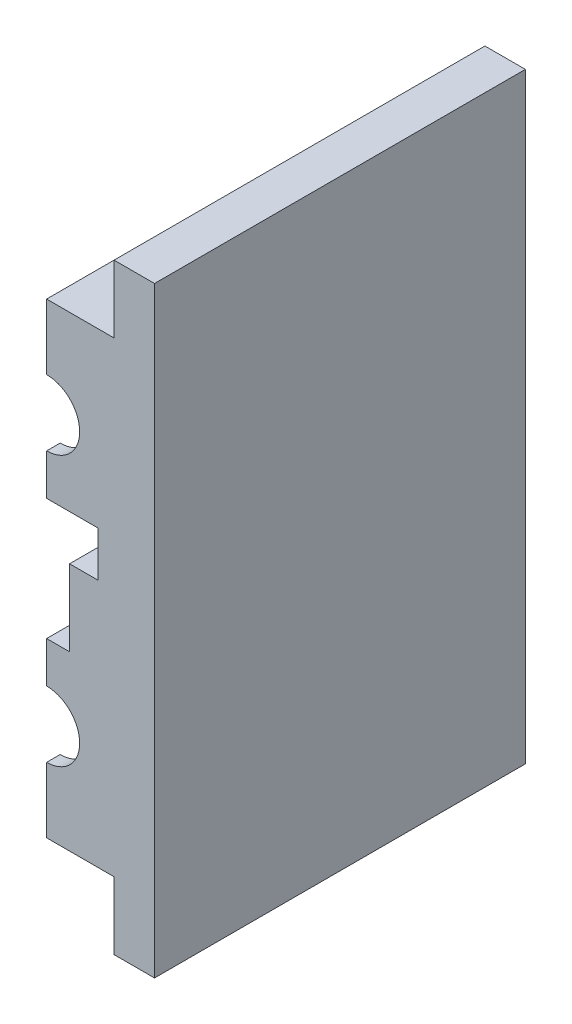
ISO-10303-21;
HEADER;
FILE_DESCRIPTION(('STEP AP214'),'2;1');
FILE_NAME('part.step','',(''),(''),'','','');
FILE_SCHEMA(('AUTOMOTIVE_DESIGN { 1 0 10303 214 1 1 1 1 }'));
ENDSEC;
DATA;
#1=APPLICATION_CONTEXT('core data for automotive mechanical design processes');
#2=APPLICATION_PROTOCOL_DEFINITION('international standard','automotive_design',2000,#1);
#3=PRODUCT_CONTEXT('',#1,'mechanical');
#4=PRODUCT('Part','Part','',(#3));
#5=PRODUCT_RELATED_PRODUCT_CATEGORY('part','',(#4));
#6=PRODUCT_DEFINITION_FORMATION('','',#4);
#7=PRODUCT_DEFINITION_CONTEXT('part definition',#1,'design');
#8=PRODUCT_DEFINITION('design','',#6,#7);
#9=PRODUCT_DEFINITION_SHAPE('','',#8);
#10=(LENGTH_UNIT() NAMED_UNIT(*) SI_UNIT(.MILLI.,.METRE.));
#11=(NAMED_UNIT(*) PLANE_ANGLE_UNIT() SI_UNIT($,.RADIAN.));
#12=(NAMED_UNIT(*) SI_UNIT($,.STERADIAN.) SOLID_ANGLE_UNIT());
#13=UNCERTAINTY_MEASURE_WITH_UNIT(LENGTH_MEASURE(1.E-05),#10,'distance_accuracy_value','');
#14=(GEOMETRIC_REPRESENTATION_CONTEXT(3) GLOBAL_UNCERTAINTY_ASSIGNED_CONTEXT((#13)) GLOBAL_UNIT_ASSIGNED_CONTEXT((#10,
#11,#12)) REPRESENTATION_CONTEXT('',''));
#15=CARTESIAN_POINT('',(0.,0.,0.));
#16=DIRECTION('',(0.,0.,1.));
#17=DIRECTION('',(1.,0.,0.));
#18=AXIS2_PLACEMENT_3D('',#15,#16,#17);
#19=CARTESIAN_POINT('',(-16.,-64.6,55.));
#20=DIRECTION('',(0.,0.,-1.));
#21=DIRECTION('',(-1.,0.,0.));
#22=AXIS2_PLACEMENT_3D('',#19,#20,#21);
#23=CYLINDRICAL_SURFACE('',#22,7.6);
#24=CARTESIAN_POINT('',(-16.,-64.6,53.));
#25=DIRECTION('',(0.,0.,-1.));
#26=DIRECTION('',(1.,0.,0.));
#27=AXIS2_PLACEMENT_3D('',#24,#25,#26);
#28=CIRCLE('',#27,7.6);
#29=CARTESIAN_POINT('',(-16.,-57.,53.));
#30=VERTEX_POINT('',#29);
#31=CARTESIAN_POINT('',(-16.,-72.2,53.));
#32=VERTEX_POINT('',#31);
#33=EDGE_CURVE('E423',#30,#32,#28,.T.);
#34=ORIENTED_EDGE('',*,*,#33,.F.);
#35=DIRECTION('',(0.,0.,-1.));
#36=VECTOR('',#35,1.);
#37=CARTESIAN_POINT('',(-16.,-57.,55.));
#38=LINE('',#37,#36);
#39=CARTESIAN_POINT('',(-16.,-57.,28.5));
#40=VERTEX_POINT('',#39);
#41=EDGE_CURVE('E344',#30,#40,#38,.T.);
#42=ORIENTED_EDGE('',*,*,#41,.T.);
#43=CARTESIAN_POINT('',(-16.,-64.6,28.5));
#44=DIRECTION('',(0.,0.,-1.));
#45=DIRECTION('',(-1.,0.,0.));
#46=AXIS2_PLACEMENT_3D('',#43,#44,#45);
#47=CIRCLE('',#46,7.6);
#48=CARTESIAN_POINT('',(-16.,-72.2,28.5));
#49=VERTEX_POINT('',#48);
#50=EDGE_CURVE('E485',#40,#49,#47,.T.);
#51=ORIENTED_EDGE('',*,*,#50,.T.);
#52=DIRECTION('',(0.,0.,-1.));
#53=VECTOR('',#52,1.);
#54=CARTESIAN_POINT('',(-16.,-72.2,55.));
#55=LINE('',#54,#53);
#56=EDGE_CURVE('E342',#32,#49,#55,.T.);
#57=ORIENTED_EDGE('',*,*,#56,.F.);
#58=EDGE_LOOP('',(#34,#42,#51,#57));
#59=FACE_BOUND('',#58,.T.);
#60=ADVANCED_FACE('F35',(#59),#23,.F.);
#61=CARTESIAN_POINT('',(-16.,-24.6,55.));
#62=DIRECTION('',(0.,0.,-1.));
#63=DIRECTION('',(-1.,0.,0.));
#64=AXIS2_PLACEMENT_3D('',#61,#62,#63);
#65=CYLINDRICAL_SURFACE('',#64,7.6);
#66=CARTESIAN_POINT('',(-16.,-24.6,53.));
#67=DIRECTION('',(0.,0.,-1.));
#68=DIRECTION('',(1.,0.,0.));
#69=AXIS2_PLACEMENT_3D('',#66,#67,#68);
#70=CIRCLE('',#69,7.6);
#71=CARTESIAN_POINT('',(-16.,-17.,53.));
#72=VERTEX_POINT('',#71);
#73=CARTESIAN_POINT('',(-16.,-32.2,53.));
#74=VERTEX_POINT('',#73);
#75=EDGE_CURVE('E438',#72,#74,#70,.T.);
#76=ORIENTED_EDGE('',*,*,#75,.F.);
#77=DIRECTION('',(0.,0.,-1.));
#78=VECTOR('',#77,1.);
#79=CARTESIAN_POINT('',(-16.,-17.,55.));
#80=LINE('',#79,#78);
#81=CARTESIAN_POINT('',(-16.,-17.,28.5));
#82=VERTEX_POINT('',#81);
#83=EDGE_CURVE('E359',#72,#82,#80,.T.);
#84=ORIENTED_EDGE('',*,*,#83,.T.);
#85=CARTESIAN_POINT('',(-16.,-24.6,28.5));
#86=DIRECTION('',(0.,0.,-1.));
#87=DIRECTION('',(-1.,0.,0.));
#88=AXIS2_PLACEMENT_3D('',#85,#86,#87);
#89=CIRCLE('',#88,7.6);
#90=CARTESIAN_POINT('',(-16.,-32.2,28.5));
#91=VERTEX_POINT('',#90);
#92=EDGE_CURVE('E509',#82,#91,#89,.T.);
#93=ORIENTED_EDGE('',*,*,#92,.T.);
#94=DIRECTION('',(0.,0.,-1.));
#95=VECTOR('',#94,1.);
#96=CARTESIAN_POINT('',(-16.,-32.2,55.));
#97=LINE('',#96,#95);
#98=EDGE_CURVE('E356',#74,#91,#97,.T.);
#99=ORIENTED_EDGE('',*,*,#98,.F.);
#100=EDGE_LOOP('',(#76,#84,#93,#99));
#101=FACE_BOUND('',#100,.T.);
#102=ADVANCED_FACE('F613',(#101),#65,.F.);
#103=CARTESIAN_POINT('',(-6.,0.,55.));
#104=DIRECTION('',(0.,-1.,0.));
#105=DIRECTION('',(0.,0.,-1.));
#106=AXIS2_PLACEMENT_3D('',#103,#104,#105);
#107=PLANE('',#106);
#108=DIRECTION('',(-1.,0.,0.));
#109=VECTOR('',#108,1.);
#110=CARTESIAN_POINT('',(-6.,0.,0.));
#111=LINE('',#110,#109);
#112=CARTESIAN_POINT('',(0.,0.,0.));
#113=VERTEX_POINT('',#112);
#114=CARTESIAN_POINT('',(-6.,0.,0.));
#115=VERTEX_POINT('',#114);
#116=EDGE_CURVE('E295',#113,#115,#111,.T.);
#117=ORIENTED_EDGE('',*,*,#116,.T.);
#118=DIRECTION('',(0.,0.,-1.));
#119=VECTOR('',#118,1.);
#120=CARTESIAN_POINT('',(-6.,0.,55.));
#121=LINE('',#120,#119);
#122=CARTESIAN_POINT('',(-6.,0.,55.));
#123=VERTEX_POINT('',#122);
#124=EDGE_CURVE('E11',#123,#115,#121,.T.);
#125=ORIENTED_EDGE('',*,*,#124,.F.);
#126=DIRECTION('',(-1.,0.,0.));
#127=VECTOR('',#126,1.);
#128=CARTESIAN_POINT('',(-6.,0.,55.));
#129=LINE('',#128,#127);
#130=CARTESIAN_POINT('',(0.,0.,55.));
#131=VERTEX_POINT('',#130);
#132=EDGE_CURVE('E326',#131,#123,#129,.T.);
#133=ORIENTED_EDGE('',*,*,#132,.F.);
#134=DIRECTION('',(0.,0.,-1.));
#135=VECTOR('',#134,1.);
#136=CARTESIAN_POINT('',(0.,0.,55.));
#137=LINE('',#136,#135);
#138=EDGE_CURVE('E294',#131,#113,#137,.T.);
#139=ORIENTED_EDGE('',*,*,#138,.T.);
#140=EDGE_LOOP('',(#117,#125,#133,#139));
#141=FACE_BOUND('',#140,.T.);
#142=ADVANCED_FACE('F37',(#141),#107,.F.);
#143=CARTESIAN_POINT('',(-6.,-10.,55.));
#144=DIRECTION('',(1.,0.,0.));
#145=DIRECTION('',(0.,1.,0.));
#146=AXIS2_PLACEMENT_3D('',#143,#144,#145);
#147=PLANE('',#146);
#148=DIRECTION('',(0.,-1.,0.));
#149=VECTOR('',#148,1.);
#150=CARTESIAN_POINT('',(-6.,-10.,0.));
#151=LINE('',#150,#149);
#152=CARTESIAN_POINT('',(-6.,-10.,0.));
#153=VERTEX_POINT('',#152);
#154=EDGE_CURVE('E298',#115,#153,#151,.T.);
#155=ORIENTED_EDGE('',*,*,#154,.T.);
#156=DIRECTION('',(0.,0.,-1.));
#157=VECTOR('',#156,1.);
#158=CARTESIAN_POINT('',(-6.,-10.,55.));
#159=LINE('',#158,#157);
#160=CARTESIAN_POINT('',(-6.,-10.,55.));
#161=VERTEX_POINT('',#160);
#162=EDGE_CURVE('E43',#161,#153,#159,.T.);
#163=ORIENTED_EDGE('',*,*,#162,.F.);
#164=DIRECTION('',(0.,-1.,0.));
#165=VECTOR('',#164,1.);
#166=CARTESIAN_POINT('',(-6.,-10.,55.));
#167=LINE('',#166,#165);
#168=EDGE_CURVE('E397',#123,#161,#167,.T.);
#169=ORIENTED_EDGE('',*,*,#168,.F.);
#170=ORIENTED_EDGE('',*,*,#124,.T.);
#171=EDGE_LOOP('',(#155,#163,#169,#170));
#172=FACE_BOUND('',#171,.T.);
#173=ADVANCED_FACE('F535',(#172),#147,.F.);
#174=CARTESIAN_POINT('',(-16.,-10.,55.));
#175=DIRECTION('',(0.,-1.,0.));
#176=DIRECTION('',(0.,0.,-1.));
#177=AXIS2_PLACEMENT_3D('',#174,#175,#176);
#178=PLANE('',#177);
#179=DIRECTION('',(-1.,0.,0.));
#180=VECTOR('',#179,1.);
#181=CARTESIAN_POINT('',(-16.,-10.,0.));
#182=LINE('',#181,#180);
#183=CARTESIAN_POINT('',(-16.,-10.,0.));
#184=VERTEX_POINT('',#183);
#185=EDGE_CURVE('E301',#153,#184,#182,.T.);
#186=ORIENTED_EDGE('',*,*,#185,.T.);
#187=DIRECTION('',(0.,0.,-1.));
#188=VECTOR('',#187,1.);
#189=CARTESIAN_POINT('',(-16.,-10.,55.));
#190=LINE('',#189,#188);
#191=CARTESIAN_POINT('',(-16.,-10.,55.));
#192=VERTEX_POINT('',#191);
#193=EDGE_CURVE('E361',#192,#184,#190,.T.);
#194=ORIENTED_EDGE('',*,*,#193,.F.);
#195=DIRECTION('',(-1.,0.,0.));
#196=VECTOR('',#195,1.);
#197=CARTESIAN_POINT('',(-16.,-10.,55.));
#198=LINE('',#197,#196);
#199=EDGE_CURVE('E370',#161,#192,#198,.T.);
#200=ORIENTED_EDGE('',*,*,#199,.F.);
#201=ORIENTED_EDGE('',*,*,#162,.T.);
#202=EDGE_LOOP('',(#186,#194,#200,#201));
#203=FACE_BOUND('',#202,.T.);
#204=ADVANCED_FACE('F368',(#203),#178,.F.);
#205=CARTESIAN_POINT('',(-16.,-17.,55.));
#206=DIRECTION('',(1.,0.,0.));
#207=DIRECTION('',(0.,1.,0.));
#208=AXIS2_PLACEMENT_3D('',#205,#206,#207);
#209=PLANE('',#208);
#210=DIRECTION('',(0.,-1.,0.));
#211=VECTOR('',#210,1.);
#212=CARTESIAN_POINT('',(-16.,-17.,0.));
#213=LINE('',#212,#211);
#214=CARTESIAN_POINT('',(-16.,-19.7,0.));
#215=VERTEX_POINT('',#214);
#216=EDGE_CURVE('E303',#184,#215,#213,.T.);
#217=ORIENTED_EDGE('',*,*,#216,.T.);
#218=DIRECTION('',(0.,0.,1.));
#219=VECTOR('',#218,1.);
#220=CARTESIAN_POINT('',(-16.,-19.7,0.));
#221=LINE('',#220,#219);
#222=CARTESIAN_POINT('',(-16.,-19.7,2.));
#223=VERTEX_POINT('',#222);
#224=EDGE_CURVE('E384',#215,#223,#221,.T.);
#225=ORIENTED_EDGE('',*,*,#224,.T.);
#226=DIRECTION('',(0.,1.,0.));
#227=VECTOR('',#226,1.);
#228=CARTESIAN_POINT('',(-16.,-17.,2.));
#229=LINE('',#228,#227);
#230=CARTESIAN_POINT('',(-16.,-17.,2.));
#231=VERTEX_POINT('',#230);
#232=EDGE_CURVE('E474',#223,#231,#229,.T.);
#233=ORIENTED_EDGE('',*,*,#232,.T.);
#234=CARTESIAN_POINT('',(-16.,-17.,26.5));
#235=VERTEX_POINT('',#234);
#236=EDGE_CURVE('E358',#235,#231,#80,.T.);
#237=ORIENTED_EDGE('',*,*,#236,.F.);
#238=DIRECTION('',(0.,1.,0.));
#239=VECTOR('',#238,1.);
#240=CARTESIAN_POINT('',(-16.,-19.7,26.5));
#241=LINE('',#240,#239);
#242=CARTESIAN_POINT('',(-16.,-19.7,26.5));
#243=VERTEX_POINT('',#242);
#244=EDGE_CURVE('E517',#243,#235,#241,.T.);
#245=ORIENTED_EDGE('',*,*,#244,.F.);
#246=DIRECTION('',(0.,0.,1.));
#247=VECTOR('',#246,1.);
#248=CARTESIAN_POINT('',(-16.,-19.7,26.5));
#249=LINE('',#248,#247);
#250=CARTESIAN_POINT('',(-16.,-19.7,28.5));
#251=VERTEX_POINT('',#250);
#252=EDGE_CURVE('E519',#243,#251,#249,.T.);
#253=ORIENTED_EDGE('',*,*,#252,.T.);
#254=DIRECTION('',(0.,1.,0.));
#255=VECTOR('',#254,1.);
#256=CARTESIAN_POINT('',(-16.,-19.7,28.5));
#257=LINE('',#256,#255);
#258=EDGE_CURVE('E513',#251,#82,#257,.T.);
#259=ORIENTED_EDGE('',*,*,#258,.T.);
#260=ORIENTED_EDGE('',*,*,#83,.F.);
#261=DIRECTION('',(0.,1.,0.));
#262=VECTOR('',#261,1.);
#263=CARTESIAN_POINT('',(-16.,-17.,53.));
#264=LINE('',#263,#262);
#265=CARTESIAN_POINT('',(-16.,-19.7,53.));
#266=VERTEX_POINT('',#265);
#267=EDGE_CURVE('E443',#266,#72,#264,.T.);
#268=ORIENTED_EDGE('',*,*,#267,.F.);
#269=DIRECTION('',(0.,0.,-1.));
#270=VECTOR('',#269,1.);
#271=CARTESIAN_POINT('',(-16.,-19.7,55.));
#272=LINE('',#271,#270);
#273=CARTESIAN_POINT('',(-16.,-19.7,55.));
#274=VERTEX_POINT('',#273);
#275=EDGE_CURVE('E390',#274,#266,#272,.T.);
#276=ORIENTED_EDGE('',*,*,#275,.F.);
#277=DIRECTION('',(0.,-1.,0.));
#278=VECTOR('',#277,1.);
#279=CARTESIAN_POINT('',(-16.,-17.,55.));
#280=LINE('',#279,#278);
#281=EDGE_CURVE('E388',#192,#274,#280,.T.);
#282=ORIENTED_EDGE('',*,*,#281,.F.);
#283=ORIENTED_EDGE('',*,*,#193,.T.);
#284=EDGE_LOOP('',(#217,#225,#233,#237,#245,#253,#259,#260,#268,#276,#282,#283));
#285=FACE_BOUND('',#284,.T.);
#286=ADVANCED_FACE('F382',(#285),#209,.F.);
#287=ORIENTED_EDGE('',*,*,#236,.T.);
#288=CARTESIAN_POINT('',(-16.,-24.6,2.));
#289=DIRECTION('',(0.,0.,-1.));
#290=DIRECTION('',(1.,0.,0.));
#291=AXIS2_PLACEMENT_3D('',#288,#289,#290);
#292=CIRCLE('',#291,7.6);
#293=CARTESIAN_POINT('',(-16.,-32.2,2.));
#294=VERTEX_POINT('',#293);
#295=EDGE_CURVE('E472',#231,#294,#292,.T.);
#296=ORIENTED_EDGE('',*,*,#295,.T.);
#297=CARTESIAN_POINT('',(-16.,-32.2,26.5));
#298=VERTEX_POINT('',#297);
#299=EDGE_CURVE('E355',#298,#294,#97,.T.);
#300=ORIENTED_EDGE('',*,*,#299,.F.);
#301=CARTESIAN_POINT('',(-16.,-24.6,26.5));
#302=DIRECTION('',(0.,0.,-1.));
#303=DIRECTION('',(-1.,0.,0.));
#304=AXIS2_PLACEMENT_3D('',#301,#302,#303);
#305=CIRCLE('',#304,7.6);
#306=EDGE_CURVE('E510',#235,#298,#305,.T.);
#307=ORIENTED_EDGE('',*,*,#306,.F.);
#308=EDGE_LOOP('',(#287,#296,#300,#307));
#309=FACE_BOUND('',#308,.T.);
#310=ADVANCED_FACE('F620',(#309),#65,.F.);
#311=CARTESIAN_POINT('',(-16.,-35.6,55.));
#312=DIRECTION('',(1.,0.,0.));
#313=DIRECTION('',(0.,1.,0.));
#314=AXIS2_PLACEMENT_3D('',#311,#312,#313);
#315=PLANE('',#314);
#316=DIRECTION('',(0.,-1.,0.));
#317=VECTOR('',#316,1.);
#318=CARTESIAN_POINT('',(-16.,-35.6,0.));
#319=LINE('',#318,#317);
#320=CARTESIAN_POINT('',(-16.,-29.5,0.));
#321=VERTEX_POINT('',#320);
#322=CARTESIAN_POINT('',(-16.,-35.6,0.));
#323=VERTEX_POINT('',#322);
#324=EDGE_CURVE('E305',#321,#323,#319,.T.);
#325=ORIENTED_EDGE('',*,*,#324,.T.);
#326=DIRECTION('',(0.,0.,-1.));
#327=VECTOR('',#326,1.);
#328=CARTESIAN_POINT('',(-16.,-35.6,55.));
#329=LINE('',#328,#327);
#330=CARTESIAN_POINT('',(-16.,-35.6,55.));
#331=VERTEX_POINT('',#330);
#332=EDGE_CURVE('E352',#331,#323,#329,.T.);
#333=ORIENTED_EDGE('',*,*,#332,.F.);
#334=DIRECTION('',(0.,-1.,0.));
#335=VECTOR('',#334,1.);
#336=CARTESIAN_POINT('',(-16.,-35.6,55.));
#337=LINE('',#336,#335);
#338=CARTESIAN_POINT('',(-16.,-29.5,55.));
#339=VERTEX_POINT('',#338);
#340=EDGE_CURVE('E393',#339,#331,#337,.T.);
#341=ORIENTED_EDGE('',*,*,#340,.F.);
#342=DIRECTION('',(0.,0.,-1.));
#343=VECTOR('',#342,1.);
#344=CARTESIAN_POINT('',(-16.,-29.5,55.));
#345=LINE('',#344,#343);
#346=CARTESIAN_POINT('',(-16.,-29.5,53.));
#347=VERTEX_POINT('',#346);
#348=EDGE_CURVE('E442',#339,#347,#345,.T.);
#349=ORIENTED_EDGE('',*,*,#348,.T.);
#350=DIRECTION('',(0.,1.,0.));
#351=VECTOR('',#350,1.);
#352=CARTESIAN_POINT('',(-16.,-29.5,53.));
#353=LINE('',#352,#351);
#354=EDGE_CURVE('E446',#74,#347,#353,.T.);
#355=ORIENTED_EDGE('',*,*,#354,.F.);
#356=ORIENTED_EDGE('',*,*,#98,.T.);
#357=DIRECTION('',(0.,1.,0.));
#358=VECTOR('',#357,1.);
#359=CARTESIAN_POINT('',(-16.,-32.2,28.5));
#360=LINE('',#359,#358);
#361=CARTESIAN_POINT('',(-16.,-29.5,28.5));
#362=VERTEX_POINT('',#361);
#363=EDGE_CURVE('E522',#91,#362,#360,.T.);
#364=ORIENTED_EDGE('',*,*,#363,.T.);
#365=DIRECTION('',(0.,0.,1.));
#366=VECTOR('',#365,1.);
#367=CARTESIAN_POINT('',(-16.,-29.5,26.5));
#368=LINE('',#367,#366);
#369=CARTESIAN_POINT('',(-16.,-29.5,26.5));
#370=VERTEX_POINT('',#369);
#371=EDGE_CURVE('E299',#370,#362,#368,.T.);
#372=ORIENTED_EDGE('',*,*,#371,.F.);
#373=DIRECTION('',(0.,1.,0.));
#374=VECTOR('',#373,1.);
#375=CARTESIAN_POINT('',(-16.,-32.2,26.5));
#376=LINE('',#375,#374);
#377=EDGE_CURVE('E512',#298,#370,#376,.T.);
#378=ORIENTED_EDGE('',*,*,#377,.F.);
#379=ORIENTED_EDGE('',*,*,#299,.T.);
#380=DIRECTION('',(0.,1.,0.));
#381=VECTOR('',#380,1.);
#382=CARTESIAN_POINT('',(-16.,-29.5,2.));
#383=LINE('',#382,#381);
#384=CARTESIAN_POINT('',(-16.,-29.5,2.));
#385=VERTEX_POINT('',#384);
#386=EDGE_CURVE('E476',#294,#385,#383,.T.);
#387=ORIENTED_EDGE('',*,*,#386,.T.);
#388=DIRECTION('',(0.,0.,1.));
#389=VECTOR('',#388,1.);
#390=CARTESIAN_POINT('',(-16.,-29.5,0.));
#391=LINE('',#390,#389);
#392=EDGE_CURVE('E482',#321,#385,#391,.T.);
#393=ORIENTED_EDGE('',*,*,#392,.F.);
#394=EDGE_LOOP('',(#325,#333,#341,#349,#355,#356,#364,#372,#378,#379,#387,#393));
#395=FACE_BOUND('',#394,.T.);
#396=ADVANCED_FACE('F638',(#395),#315,.F.);
#397=CARTESIAN_POINT('',(-8.4,-35.6,55.));
#398=DIRECTION('',(0.,1.,0.));
#399=DIRECTION('',(0.,0.,1.));
#400=AXIS2_PLACEMENT_3D('',#397,#398,#399);
#401=PLANE('',#400);
#402=DIRECTION('',(1.,0.,0.));
#403=VECTOR('',#402,1.);
#404=CARTESIAN_POINT('',(-8.4,-35.6,0.));
#405=LINE('',#404,#403);
#406=CARTESIAN_POINT('',(-8.4,-35.6,0.));
#407=VERTEX_POINT('',#406);
#408=EDGE_CURVE('E307',#323,#407,#405,.T.);
#409=ORIENTED_EDGE('',*,*,#408,.T.);
#410=DIRECTION('',(0.,0.,-1.));
#411=VECTOR('',#410,1.);
#412=CARTESIAN_POINT('',(-8.4,-35.6,55.));
#413=LINE('',#412,#411);
#414=CARTESIAN_POINT('',(-8.4,-35.6,55.));
#415=VERTEX_POINT('',#414);
#416=EDGE_CURVE('E349',#415,#407,#413,.T.);
#417=ORIENTED_EDGE('',*,*,#416,.F.);
#418=DIRECTION('',(1.,0.,0.));
#419=VECTOR('',#418,1.);
#420=CARTESIAN_POINT('',(-8.4,-35.6,55.));
#421=LINE('',#420,#419);
#422=EDGE_CURVE('E395',#331,#415,#421,.T.);
#423=ORIENTED_EDGE('',*,*,#422,.F.);
#424=ORIENTED_EDGE('',*,*,#332,.T.);
#425=EDGE_LOOP('',(#409,#417,#423,#424));
#426=FACE_BOUND('',#425,.T.);
#427=ADVANCED_FACE('F635',(#426),#401,.F.);
#428=CARTESIAN_POINT('',(-8.4,-42.3,55.));
#429=DIRECTION('',(1.,0.,0.));
#430=DIRECTION('',(0.,0.,-1.));
#431=AXIS2_PLACEMENT_3D('',#428,#429,#430);
#432=PLANE('',#431);
#433=DIRECTION('',(0.,-1.,0.));
#434=VECTOR('',#433,1.);
#435=CARTESIAN_POINT('',(-8.4,-42.3,0.));
#436=LINE('',#435,#434);
#437=CARTESIAN_POINT('',(-8.4,-42.3,0.));
#438=VERTEX_POINT('',#437);
#439=EDGE_CURVE('E309',#407,#438,#436,.T.);
#440=ORIENTED_EDGE('',*,*,#439,.T.);
#441=DIRECTION('',(0.,0.,-1.));
#442=VECTOR('',#441,1.);
#443=CARTESIAN_POINT('',(-8.4,-42.3,55.));
#444=LINE('',#443,#442);
#445=CARTESIAN_POINT('',(-8.4,-42.3,55.));
#446=VERTEX_POINT('',#445);
#447=EDGE_CURVE('E346',#446,#438,#444,.T.);
#448=ORIENTED_EDGE('',*,*,#447,.F.);
#449=DIRECTION('',(0.,-1.,0.));
#450=VECTOR('',#449,1.);
#451=CARTESIAN_POINT('',(-8.4,-42.3,55.));
#452=LINE('',#451,#450);
#453=EDGE_CURVE('E283',#415,#446,#452,.T.);
#454=ORIENTED_EDGE('',*,*,#453,.F.);
#455=ORIENTED_EDGE('',*,*,#416,.T.);
#456=EDGE_LOOP('',(#440,#448,#454,#455));
#457=FACE_BOUND('',#456,.T.);
#458=ADVANCED_FACE('F407',(#457),#432,.F.);
#459=CARTESIAN_POINT('',(-16.,-42.3,55.));
#460=DIRECTION('',(0.,-1.,0.));
#461=DIRECTION('',(0.,0.,-1.));
#462=AXIS2_PLACEMENT_3D('',#459,#460,#461);
#463=PLANE('',#462);
#464=DIRECTION('',(-1.,0.,0.));
#465=VECTOR('',#464,1.);
#466=CARTESIAN_POINT('',(-16.,-42.3,0.));
#467=LINE('',#466,#465);
#468=CARTESIAN_POINT('',(-12.6,-42.3,0.));
#469=VERTEX_POINT('',#468);
#470=EDGE_CURVE('E311',#438,#469,#467,.T.);
#471=ORIENTED_EDGE('',*,*,#470,.T.);
#472=DIRECTION('',(0.,0.,1.));
#473=VECTOR('',#472,1.);
#474=CARTESIAN_POINT('',(-12.6,-42.3,-11.800423721206));
#475=LINE('',#474,#473);
#476=CARTESIAN_POINT('',(-12.6,-42.3,55.));
#477=VERTEX_POINT('',#476);
#478=EDGE_CURVE('E413',#469,#477,#475,.T.);
#479=ORIENTED_EDGE('',*,*,#478,.T.);
#480=DIRECTION('',(-1.,0.,0.));
#481=VECTOR('',#480,1.);
#482=CARTESIAN_POINT('',(-16.,-42.3,55.));
#483=LINE('',#482,#481);
#484=EDGE_CURVE('E279',#446,#477,#483,.T.);
#485=ORIENTED_EDGE('',*,*,#484,.F.);
#486=ORIENTED_EDGE('',*,*,#447,.T.);
#487=EDGE_LOOP('',(#471,#479,#485,#486));
#488=FACE_BOUND('',#487,.T.);
#489=ADVANCED_FACE('F412',(#488),#463,.F.);
#490=CARTESIAN_POINT('',(-16.,-57.,55.));
#491=DIRECTION('',(1.,0.,0.));
#492=DIRECTION('',(0.,0.,-1.));
#493=AXIS2_PLACEMENT_3D('',#490,#491,#492);
#494=PLANE('',#493);
#495=DIRECTION('',(0.,-1.,0.));
#496=VECTOR('',#495,1.);
#497=CARTESIAN_POINT('',(-16.,-57.,55.));
#498=LINE('',#497,#496);
#499=CARTESIAN_POINT('',(-16.,-53.6,55.));
#500=VERTEX_POINT('',#499);
#501=CARTESIAN_POINT('',(-16.,-59.7,55.));
#502=VERTEX_POINT('',#501);
#503=EDGE_CURVE('E270',#500,#502,#498,.T.);
#504=ORIENTED_EDGE('',*,*,#503,.F.);
#505=DIRECTION('',(0.,0.,1.));
#506=VECTOR('',#505,1.);
#507=CARTESIAN_POINT('',(-16.,-53.6,-11.800423721206));
#508=LINE('',#507,#506);
#509=CARTESIAN_POINT('',(-16.,-53.6,0.));
#510=VERTEX_POINT('',#509);
#511=EDGE_CURVE('E255',#510,#500,#508,.T.);
#512=ORIENTED_EDGE('',*,*,#511,.F.);
#513=DIRECTION('',(0.,-1.,0.));
#514=VECTOR('',#513,1.);
#515=CARTESIAN_POINT('',(-16.,-57.,0.));
#516=LINE('',#515,#514);
#517=CARTESIAN_POINT('',(-16.,-59.7,0.));
#518=VERTEX_POINT('',#517);
#519=EDGE_CURVE('E314',#510,#518,#516,.T.);
#520=ORIENTED_EDGE('',*,*,#519,.T.);
#521=DIRECTION('',(0.,0.,1.));
#522=VECTOR('',#521,1.);
#523=CARTESIAN_POINT('',(-16.,-59.7,0.));
#524=LINE('',#523,#522);
#525=CARTESIAN_POINT('',(-16.,-59.7,2.));
#526=VERTEX_POINT('',#525);
#527=EDGE_CURVE('E459',#518,#526,#524,.T.);
#528=ORIENTED_EDGE('',*,*,#527,.T.);
#529=DIRECTION('',(0.,1.,0.));
#530=VECTOR('',#529,1.);
#531=CARTESIAN_POINT('',(-16.,-57.,2.));
#532=LINE('',#531,#530);
#533=CARTESIAN_POINT('',(-16.,-57.,2.));
#534=VERTEX_POINT('',#533);
#535=EDGE_CURVE('E460',#526,#534,#532,.T.);
#536=ORIENTED_EDGE('',*,*,#535,.T.);
#537=CARTESIAN_POINT('',(-16.,-57.,26.5));
#538=VERTEX_POINT('',#537);
#539=EDGE_CURVE('E58',#538,#534,#38,.T.);
#540=ORIENTED_EDGE('',*,*,#539,.F.);
#541=DIRECTION('',(0.,1.,0.));
#542=VECTOR('',#541,1.);
#543=CARTESIAN_POINT('',(-16.,-59.7,26.5));
#544=LINE('',#543,#542);
#545=CARTESIAN_POINT('',(-16.,-59.7,26.5));
#546=VERTEX_POINT('',#545);
#547=EDGE_CURVE('E493',#546,#538,#544,.T.);
#548=ORIENTED_EDGE('',*,*,#547,.F.);
#549=DIRECTION('',(0.,0.,1.));
#550=VECTOR('',#549,1.);
#551=CARTESIAN_POINT('',(-16.,-59.7,26.5));
#552=LINE('',#551,#550);
#553=CARTESIAN_POINT('',(-16.,-59.7,28.5));
#554=VERTEX_POINT('',#553);
#555=EDGE_CURVE('E495',#546,#554,#552,.T.);
#556=ORIENTED_EDGE('',*,*,#555,.T.);
#557=DIRECTION('',(0.,1.,0.));
#558=VECTOR('',#557,1.);
#559=CARTESIAN_POINT('',(-16.,-59.7,28.5));
#560=LINE('',#559,#558);
#561=EDGE_CURVE('E489',#554,#40,#560,.T.);
#562=ORIENTED_EDGE('',*,*,#561,.T.);
#563=ORIENTED_EDGE('',*,*,#41,.F.);
#564=DIRECTION('',(0.,1.,0.));
#565=VECTOR('',#564,1.);
#566=CARTESIAN_POINT('',(-16.,-57.,53.));
#567=LINE('',#566,#565);
#568=CARTESIAN_POINT('',(-16.,-59.7,53.));
#569=VERTEX_POINT('',#568);
#570=EDGE_CURVE('E427',#569,#30,#567,.T.);
#571=ORIENTED_EDGE('',*,*,#570,.F.);
#572=DIRECTION('',(0.,0.,-1.));
#573=VECTOR('',#572,1.);
#574=CARTESIAN_POINT('',(-16.,-59.7,55.));
#575=LINE('',#574,#573);
#576=EDGE_CURVE('E276',#502,#569,#575,.T.);
#577=ORIENTED_EDGE('',*,*,#576,.F.);
#578=EDGE_LOOP('',(#504,#512,#520,#528,#536,#540,#548,#556,#562,#563,#571,#577));
#579=FACE_BOUND('',#578,.T.);
#580=ADVANCED_FACE('F274',(#579),#494,.F.);
#581=ORIENTED_EDGE('',*,*,#539,.T.);
#582=CARTESIAN_POINT('',(-16.,-64.6,2.));
#583=DIRECTION('',(0.,0.,-1.));
#584=DIRECTION('',(1.,0.,0.));
#585=AXIS2_PLACEMENT_3D('',#582,#583,#584);
#586=CIRCLE('',#585,7.6);
#587=CARTESIAN_POINT('',(-16.,-72.2,2.));
#588=VERTEX_POINT('',#587);
#589=EDGE_CURVE('E454',#534,#588,#586,.T.);
#590=ORIENTED_EDGE('',*,*,#589,.T.);
#591=CARTESIAN_POINT('',(-16.,-72.2,26.5));
#592=VERTEX_POINT('',#591);
#593=EDGE_CURVE('E341',#592,#588,#55,.T.);
#594=ORIENTED_EDGE('',*,*,#593,.F.);
#595=CARTESIAN_POINT('',(-16.,-64.6,26.5));
#596=DIRECTION('',(0.,0.,-1.));
#597=DIRECTION('',(-1.,0.,0.));
#598=AXIS2_PLACEMENT_3D('',#595,#596,#597);
#599=CIRCLE('',#598,7.6);
#600=EDGE_CURVE('E486',#538,#592,#599,.T.);
#601=ORIENTED_EDGE('',*,*,#600,.F.);
#602=EDGE_LOOP('',(#581,#590,#594,#601));
#603=FACE_BOUND('',#602,.T.);
#604=ADVANCED_FACE('F574',(#603),#23,.F.);
#605=CARTESIAN_POINT('',(-16.,-79.2,55.));
#606=DIRECTION('',(1.,0.,0.));
#607=DIRECTION('',(0.,0.,-1.));
#608=AXIS2_PLACEMENT_3D('',#605,#606,#607);
#609=PLANE('',#608);
#610=DIRECTION('',(0.,-1.,0.));
#611=VECTOR('',#610,1.);
#612=CARTESIAN_POINT('',(-16.,-79.2,0.));
#613=LINE('',#612,#611);
#614=CARTESIAN_POINT('',(-16.,-69.5,0.));
#615=VERTEX_POINT('',#614);
#616=CARTESIAN_POINT('',(-16.,-79.2,0.));
#617=VERTEX_POINT('',#616);
#618=EDGE_CURVE('E316',#615,#617,#613,.T.);
#619=ORIENTED_EDGE('',*,*,#618,.T.);
#620=DIRECTION('',(0.,0.,-1.));
#621=VECTOR('',#620,1.);
#622=CARTESIAN_POINT('',(-16.,-79.2,55.));
#623=LINE('',#622,#621);
#624=CARTESIAN_POINT('',(-16.,-79.2,55.));
#625=VERTEX_POINT('',#624);
#626=EDGE_CURVE('E338',#625,#617,#623,.T.);
#627=ORIENTED_EDGE('',*,*,#626,.F.);
#628=DIRECTION('',(0.,-1.,0.));
#629=VECTOR('',#628,1.);
#630=CARTESIAN_POINT('',(-16.,-79.2,55.));
#631=LINE('',#630,#629);
#632=CARTESIAN_POINT('',(-16.,-69.5,55.));
#633=VERTEX_POINT('',#632);
#634=EDGE_CURVE('E278',#633,#625,#631,.T.);
#635=ORIENTED_EDGE('',*,*,#634,.F.);
#636=DIRECTION('',(0.,0.,-1.));
#637=VECTOR('',#636,1.);
#638=CARTESIAN_POINT('',(-16.,-69.5,55.));
#639=LINE('',#638,#637);
#640=CARTESIAN_POINT('',(-16.,-69.5,53.));
#641=VERTEX_POINT('',#640);
#642=EDGE_CURVE('E426',#633,#641,#639,.T.);
#643=ORIENTED_EDGE('',*,*,#642,.T.);
#644=DIRECTION('',(0.,1.,0.));
#645=VECTOR('',#644,1.);
#646=CARTESIAN_POINT('',(-16.,-69.5,53.));
#647=LINE('',#646,#645);
#648=EDGE_CURVE('E430',#32,#641,#647,.T.);
#649=ORIENTED_EDGE('',*,*,#648,.F.);
#650=ORIENTED_EDGE('',*,*,#56,.T.);
#651=DIRECTION('',(0.,1.,0.));
#652=VECTOR('',#651,1.);
#653=CARTESIAN_POINT('',(-16.,-72.2,28.5));
#654=LINE('',#653,#652);
#655=CARTESIAN_POINT('',(-16.,-69.5,28.5));
#656=VERTEX_POINT('',#655);
#657=EDGE_CURVE('E498',#49,#656,#654,.T.);
#658=ORIENTED_EDGE('',*,*,#657,.T.);
#659=DIRECTION('',(0.,0.,1.));
#660=VECTOR('',#659,1.);
#661=CARTESIAN_POINT('',(-16.,-69.5,26.5));
#662=LINE('',#661,#660);
#663=CARTESIAN_POINT('',(-16.,-69.5,26.5));
#664=VERTEX_POINT('',#663);
#665=EDGE_CURVE('E506',#664,#656,#662,.T.);
#666=ORIENTED_EDGE('',*,*,#665,.F.);
#667=DIRECTION('',(0.,1.,0.));
#668=VECTOR('',#667,1.);
#669=CARTESIAN_POINT('',(-16.,-72.2,26.5));
#670=LINE('',#669,#668);
#671=EDGE_CURVE('E488',#592,#664,#670,.T.);
#672=ORIENTED_EDGE('',*,*,#671,.F.);
#673=ORIENTED_EDGE('',*,*,#593,.T.);
#674=DIRECTION('',(0.,1.,0.));
#675=VECTOR('',#674,1.);
#676=CARTESIAN_POINT('',(-16.,-69.5,2.));
#677=LINE('',#676,#675);
#678=CARTESIAN_POINT('',(-16.,-69.5,2.));
#679=VERTEX_POINT('',#678);
#680=EDGE_CURVE('E462',#588,#679,#677,.T.);
#681=ORIENTED_EDGE('',*,*,#680,.T.);
#682=DIRECTION('',(0.,0.,1.));
#683=VECTOR('',#682,1.);
#684=CARTESIAN_POINT('',(-16.,-69.5,0.));
#685=LINE('',#684,#683);
#686=EDGE_CURVE('E469',#615,#679,#685,.T.);
#687=ORIENTED_EDGE('',*,*,#686,.F.);
#688=EDGE_LOOP('',(#619,#627,#635,#643,#649,#650,#658,#666,#672,#673,#681,#687));
#689=FACE_BOUND('',#688,.T.);
#690=ADVANCED_FACE('F560',(#689),#609,.F.);
#691=CARTESIAN_POINT('',(-6.,-79.2,55.));
#692=DIRECTION('',(0.,1.,0.));
#693=DIRECTION('',(0.,0.,1.));
#694=AXIS2_PLACEMENT_3D('',#691,#692,#693);
#695=PLANE('',#694);
#696=DIRECTION('',(1.,0.,0.));
#697=VECTOR('',#696,1.);
#698=CARTESIAN_POINT('',(-6.,-79.2,0.));
#699=LINE('',#698,#697);
#700=CARTESIAN_POINT('',(-6.,-79.2,0.));
#701=VERTEX_POINT('',#700);
#702=EDGE_CURVE('E318',#617,#701,#699,.T.);
#703=ORIENTED_EDGE('',*,*,#702,.T.);
#704=DIRECTION('',(0.,0.,-1.));
#705=VECTOR('',#704,1.);
#706=CARTESIAN_POINT('',(-6.,-79.2,55.));
#707=LINE('',#706,#705);
#708=CARTESIAN_POINT('',(-6.,-79.2,55.));
#709=VERTEX_POINT('',#708);
#710=EDGE_CURVE('E335',#709,#701,#707,.T.);
#711=ORIENTED_EDGE('',*,*,#710,.F.);
#712=DIRECTION('',(1.,0.,0.));
#713=VECTOR('',#712,1.);
#714=CARTESIAN_POINT('',(-6.,-79.2,55.));
#715=LINE('',#714,#713);
#716=EDGE_CURVE('E281',#625,#709,#715,.T.);
#717=ORIENTED_EDGE('',*,*,#716,.F.);
#718=ORIENTED_EDGE('',*,*,#626,.T.);
#719=EDGE_LOOP('',(#703,#711,#717,#718));
#720=FACE_BOUND('',#719,.T.);
#721=ADVANCED_FACE('F556',(#720),#695,.F.);
#722=CARTESIAN_POINT('',(-6.,-89.2,55.));
#723=DIRECTION('',(1.,0.,0.));
#724=DIRECTION('',(0.,1.,0.));
#725=AXIS2_PLACEMENT_3D('',#722,#723,#724);
#726=PLANE('',#725);
#727=DIRECTION('',(0.,-1.,0.));
#728=VECTOR('',#727,1.);
#729=CARTESIAN_POINT('',(-6.,-89.2,0.));
#730=LINE('',#729,#728);
#731=CARTESIAN_POINT('',(-6.,-89.2,0.));
#732=VERTEX_POINT('',#731);
#733=EDGE_CURVE('E320',#701,#732,#730,.T.);
#734=ORIENTED_EDGE('',*,*,#733,.T.);
#735=DIRECTION('',(0.,0.,-1.));
#736=VECTOR('',#735,1.);
#737=CARTESIAN_POINT('',(-6.,-89.2,55.));
#738=LINE('',#737,#736);
#739=CARTESIAN_POINT('',(-6.,-89.2,55.));
#740=VERTEX_POINT('',#739);
#741=EDGE_CURVE('E332',#740,#732,#738,.T.);
#742=ORIENTED_EDGE('',*,*,#741,.F.);
#743=DIRECTION('',(0.,-1.,0.));
#744=VECTOR('',#743,1.);
#745=CARTESIAN_POINT('',(-6.,-89.2,55.));
#746=LINE('',#745,#744);
#747=EDGE_CURVE('E288',#709,#740,#746,.T.);
#748=ORIENTED_EDGE('',*,*,#747,.F.);
#749=ORIENTED_EDGE('',*,*,#710,.T.);
#750=EDGE_LOOP('',(#734,#742,#748,#749));
#751=FACE_BOUND('',#750,.T.);
#752=ADVANCED_FACE('F551',(#751),#726,.F.);
#753=CARTESIAN_POINT('',(0.,-89.2,55.));
#754=DIRECTION('',(0.,1.,0.));
#755=DIRECTION('',(0.,0.,1.));
#756=AXIS2_PLACEMENT_3D('',#753,#754,#755);
#757=PLANE('',#756);
#758=DIRECTION('',(1.,0.,0.));
#759=VECTOR('',#758,1.);
#760=CARTESIAN_POINT('',(0.,-89.2,0.));
#761=LINE('',#760,#759);
#762=CARTESIAN_POINT('',(0.,-89.2,0.));
#763=VERTEX_POINT('',#762);
#764=EDGE_CURVE('E322',#732,#763,#761,.T.);
#765=ORIENTED_EDGE('',*,*,#764,.T.);
#766=DIRECTION('',(0.,0.,-1.));
#767=VECTOR('',#766,1.);
#768=CARTESIAN_POINT('',(0.,-89.2,55.));
#769=LINE('',#768,#767);
#770=CARTESIAN_POINT('',(0.,-89.2,55.));
#771=VERTEX_POINT('',#770);
#772=EDGE_CURVE('E329',#771,#763,#769,.T.);
#773=ORIENTED_EDGE('',*,*,#772,.F.);
#774=DIRECTION('',(1.,0.,0.));
#775=VECTOR('',#774,1.);
#776=CARTESIAN_POINT('',(0.,-89.2,55.));
#777=LINE('',#776,#775);
#778=EDGE_CURVE('E290',#740,#771,#777,.T.);
#779=ORIENTED_EDGE('',*,*,#778,.F.);
#780=ORIENTED_EDGE('',*,*,#741,.T.);
#781=EDGE_LOOP('',(#765,#773,#779,#780));
#782=FACE_BOUND('',#781,.T.);
#783=ADVANCED_FACE('F547',(#782),#757,.F.);
#784=CARTESIAN_POINT('',(0.,0.,55.));
#785=DIRECTION('',(-1.,0.,0.));
#786=DIRECTION('',(0.,-1.,0.));
#787=AXIS2_PLACEMENT_3D('',#784,#785,#786);
#788=PLANE('',#787);
#789=DIRECTION('',(0.,1.,0.));
#790=VECTOR('',#789,1.);
#791=CARTESIAN_POINT('',(0.,0.,0.));
#792=LINE('',#791,#790);
#793=EDGE_CURVE('E324',#763,#113,#792,.T.);
#794=ORIENTED_EDGE('',*,*,#793,.T.);
#795=ORIENTED_EDGE('',*,*,#138,.F.);
#796=DIRECTION('',(0.,1.,0.));
#797=VECTOR('',#796,1.);
#798=CARTESIAN_POINT('',(0.,0.,55.));
#799=LINE('',#798,#797);
#800=EDGE_CURVE('E292',#771,#131,#799,.T.);
#801=ORIENTED_EDGE('',*,*,#800,.F.);
#802=ORIENTED_EDGE('',*,*,#772,.T.);
#803=EDGE_LOOP('',(#794,#795,#801,#802));
#804=FACE_BOUND('',#803,.T.);
#805=ADVANCED_FACE('F542',(#804),#788,.F.);
#806=CARTESIAN_POINT('',(-16.,-64.6,55.));
#807=DIRECTION('',(0.,0.,1.));
#808=DIRECTION('',(1.,0.,0.));
#809=AXIS2_PLACEMENT_3D('',#806,#807,#808);
#810=PLANE('',#809);
#811=DIRECTION('',(0.,1.,0.));
#812=VECTOR('',#811,1.);
#813=CARTESIAN_POINT('',(-12.6,-42.3,55.));
#814=LINE('',#813,#812);
#815=CARTESIAN_POINT('',(-12.6,-53.6,55.));
#816=VERTEX_POINT('',#815);
#817=EDGE_CURVE('E265',#816,#477,#814,.T.);
#818=ORIENTED_EDGE('',*,*,#817,.F.);
#819=DIRECTION('',(1.,0.,0.));
#820=VECTOR('',#819,1.);
#821=CARTESIAN_POINT('',(-16.,-53.6,55.));
#822=LINE('',#821,#820);
#823=EDGE_CURVE('E258',#500,#816,#822,.T.);
#824=ORIENTED_EDGE('',*,*,#823,.F.);
#825=ORIENTED_EDGE('',*,*,#503,.T.);
#826=CARTESIAN_POINT('',(-16.,-64.6,55.));
#827=DIRECTION('',(0.,0.,1.));
#828=DIRECTION('',(-1.,0.,0.));
#829=AXIS2_PLACEMENT_3D('',#826,#827,#828);
#830=CIRCLE('',#829,4.9);
#831=EDGE_CURVE('E424',#633,#502,#830,.T.);
#832=ORIENTED_EDGE('',*,*,#831,.F.);
#833=ORIENTED_EDGE('',*,*,#634,.T.);
#834=ORIENTED_EDGE('',*,*,#716,.T.);
#835=ORIENTED_EDGE('',*,*,#747,.T.);
#836=ORIENTED_EDGE('',*,*,#778,.T.);
#837=ORIENTED_EDGE('',*,*,#800,.T.);
#838=ORIENTED_EDGE('',*,*,#132,.T.);
#839=ORIENTED_EDGE('',*,*,#168,.T.);
#840=ORIENTED_EDGE('',*,*,#199,.T.);
#841=ORIENTED_EDGE('',*,*,#281,.T.);
#842=CARTESIAN_POINT('',(-16.,-24.6,55.));
#843=DIRECTION('',(0.,0.,1.));
#844=DIRECTION('',(-1.,0.,0.));
#845=AXIS2_PLACEMENT_3D('',#842,#843,#844);
#846=CIRCLE('',#845,4.9);
#847=EDGE_CURVE('E440',#339,#274,#846,.T.);
#848=ORIENTED_EDGE('',*,*,#847,.F.);
#849=ORIENTED_EDGE('',*,*,#340,.T.);
#850=ORIENTED_EDGE('',*,*,#422,.T.);
#851=ORIENTED_EDGE('',*,*,#453,.T.);
#852=ORIENTED_EDGE('',*,*,#484,.T.);
#853=EDGE_LOOP('',(#818,#824,#825,#832,#833,#834,#835,#836,#837,#838,#839,#840,#841,#848,#849,
#850,#851,#852));
#854=FACE_BOUND('',#853,.T.);
#855=ADVANCED_FACE('F268',(#854),#810,.T.);
#856=CARTESIAN_POINT('',(-16.,-64.6,0.));
#857=DIRECTION('',(0.,0.,1.));
#858=DIRECTION('',(1.,0.,0.));
#859=AXIS2_PLACEMENT_3D('',#856,#857,#858);
#860=PLANE('',#859);
#861=DIRECTION('',(-1.,0.,0.));
#862=VECTOR('',#861,1.);
#863=CARTESIAN_POINT('',(-16.,-53.6,0.));
#864=LINE('',#863,#862);
#865=CARTESIAN_POINT('',(-12.6,-53.6,0.));
#866=VERTEX_POINT('',#865);
#867=EDGE_CURVE('E261',#866,#510,#864,.T.);
#868=ORIENTED_EDGE('',*,*,#867,.F.);
#869=DIRECTION('',(0.,-1.,0.));
#870=VECTOR('',#869,1.);
#871=CARTESIAN_POINT('',(-12.6,-42.3,0.));
#872=LINE('',#871,#870);
#873=EDGE_CURVE('E416',#469,#866,#872,.T.);
#874=ORIENTED_EDGE('',*,*,#873,.F.);
#875=ORIENTED_EDGE('',*,*,#470,.F.);
#876=ORIENTED_EDGE('',*,*,#439,.F.);
#877=ORIENTED_EDGE('',*,*,#408,.F.);
#878=ORIENTED_EDGE('',*,*,#324,.F.);
#879=CARTESIAN_POINT('',(-16.,-24.6,0.));
#880=DIRECTION('',(0.,0.,1.));
#881=DIRECTION('',(-1.,0.,0.));
#882=AXIS2_PLACEMENT_3D('',#879,#880,#881);
#883=CIRCLE('',#882,4.9);
#884=EDGE_CURVE('E378',#321,#215,#883,.T.);
#885=ORIENTED_EDGE('',*,*,#884,.T.);
#886=ORIENTED_EDGE('',*,*,#216,.F.);
#887=ORIENTED_EDGE('',*,*,#185,.F.);
#888=ORIENTED_EDGE('',*,*,#154,.F.);
#889=ORIENTED_EDGE('',*,*,#116,.F.);
#890=ORIENTED_EDGE('',*,*,#793,.F.);
#891=ORIENTED_EDGE('',*,*,#764,.F.);
#892=ORIENTED_EDGE('',*,*,#733,.F.);
#893=ORIENTED_EDGE('',*,*,#702,.F.);
#894=ORIENTED_EDGE('',*,*,#618,.F.);
#895=CARTESIAN_POINT('',(-16.,-64.6,0.));
#896=DIRECTION('',(0.,0.,1.));
#897=DIRECTION('',(-1.,0.,0.));
#898=AXIS2_PLACEMENT_3D('',#895,#896,#897);
#899=CIRCLE('',#898,4.9);
#900=EDGE_CURVE('E456',#615,#518,#899,.T.);
#901=ORIENTED_EDGE('',*,*,#900,.T.);
#902=ORIENTED_EDGE('',*,*,#519,.F.);
#903=EDGE_LOOP('',(#868,#874,#875,#876,#877,#878,#885,#886,#887,#888,#889,#890,#891,#892,#893,
#894,#901,#902));
#904=FACE_BOUND('',#903,.T.);
#905=ADVANCED_FACE('F374',(#904),#860,.F.);
#906=CARTESIAN_POINT('',(-16.,-24.6,26.5));
#907=DIRECTION('',(0.,0.,1.));
#908=DIRECTION('',(1.,0.,0.));
#909=AXIS2_PLACEMENT_3D('',#906,#907,#908);
#910=CYLINDRICAL_SURFACE('',#909,4.9);
#911=CARTESIAN_POINT('',(-16.,-24.6,28.5));
#912=DIRECTION('',(0.,0.,1.));
#913=DIRECTION('',(-1.,0.,0.));
#914=AXIS2_PLACEMENT_3D('',#911,#912,#913);
#915=CIRCLE('',#914,4.9);
#916=EDGE_CURVE('E524',#362,#251,#915,.T.);
#917=ORIENTED_EDGE('',*,*,#916,.T.);
#918=ORIENTED_EDGE('',*,*,#252,.F.);
#919=CARTESIAN_POINT('',(-16.,-24.6,26.5));
#920=DIRECTION('',(0.,0.,1.));
#921=DIRECTION('',(-1.,0.,0.));
#922=AXIS2_PLACEMENT_3D('',#919,#920,#921);
#923=CIRCLE('',#922,4.9);
#924=EDGE_CURVE('E515',#370,#243,#923,.T.);
#925=ORIENTED_EDGE('',*,*,#924,.F.);
#926=ORIENTED_EDGE('',*,*,#371,.T.);
#927=EDGE_LOOP('',(#917,#918,#925,#926));
#928=FACE_BOUND('',#927,.T.);
#929=ADVANCED_FACE('F756',(#928),#910,.F.);
#930=CARTESIAN_POINT('',(-16.,-24.6,26.5));
#931=DIRECTION('',(0.,0.,-1.));
#932=DIRECTION('',(-1.,0.,0.));
#933=AXIS2_PLACEMENT_3D('',#930,#931,#932);
#934=PLANE('',#933);
#935=ORIENTED_EDGE('',*,*,#306,.T.);
#936=ORIENTED_EDGE('',*,*,#377,.T.);
#937=ORIENTED_EDGE('',*,*,#924,.T.);
#938=ORIENTED_EDGE('',*,*,#244,.T.);
#939=EDGE_LOOP('',(#935,#936,#937,#938));
#940=FACE_BOUND('',#939,.T.);
#941=ADVANCED_FACE('F607',(#940),#934,.T.);
#942=CARTESIAN_POINT('',(-16.,-24.6,28.5));
#943=DIRECTION('',(0.,0.,-1.));
#944=DIRECTION('',(-1.,0.,0.));
#945=AXIS2_PLACEMENT_3D('',#942,#943,#944);
#946=PLANE('',#945);
#947=ORIENTED_EDGE('',*,*,#92,.F.);
#948=ORIENTED_EDGE('',*,*,#258,.F.);
#949=ORIENTED_EDGE('',*,*,#916,.F.);
#950=ORIENTED_EDGE('',*,*,#363,.F.);
#951=EDGE_LOOP('',(#947,#948,#949,#950));
#952=FACE_BOUND('',#951,.T.);
#953=ADVANCED_FACE('F600',(#952),#946,.F.);
#954=CARTESIAN_POINT('',(-16.,-64.6,26.5));
#955=DIRECTION('',(0.,0.,1.));
#956=DIRECTION('',(1.,0.,0.));
#957=AXIS2_PLACEMENT_3D('',#954,#955,#956);
#958=CYLINDRICAL_SURFACE('',#957,4.9);
#959=CARTESIAN_POINT('',(-16.,-64.6,28.5));
#960=DIRECTION('',(0.,0.,1.));
#961=DIRECTION('',(-1.,0.,0.));
#962=AXIS2_PLACEMENT_3D('',#959,#960,#961);
#963=CIRCLE('',#962,4.9);
#964=EDGE_CURVE('E500',#656,#554,#963,.T.);
#965=ORIENTED_EDGE('',*,*,#964,.T.);
#966=ORIENTED_EDGE('',*,*,#555,.F.);
#967=CARTESIAN_POINT('',(-16.,-64.6,26.5));
#968=DIRECTION('',(0.,0.,1.));
#969=DIRECTION('',(-1.,0.,0.));
#970=AXIS2_PLACEMENT_3D('',#967,#968,#969);
#971=CIRCLE('',#970,4.9);
#972=EDGE_CURVE('E491',#664,#546,#971,.T.);
#973=ORIENTED_EDGE('',*,*,#972,.F.);
#974=ORIENTED_EDGE('',*,*,#665,.T.);
#975=EDGE_LOOP('',(#965,#966,#973,#974));
#976=FACE_BOUND('',#975,.T.);
#977=ADVANCED_FACE('F598',(#976),#958,.F.);
#978=CARTESIAN_POINT('',(-16.,-64.6,26.5));
#979=DIRECTION('',(0.,0.,-1.));
#980=DIRECTION('',(-1.,0.,0.));
#981=AXIS2_PLACEMENT_3D('',#978,#979,#980);
#982=PLANE('',#981);
#983=ORIENTED_EDGE('',*,*,#600,.T.);
#984=ORIENTED_EDGE('',*,*,#671,.T.);
#985=ORIENTED_EDGE('',*,*,#972,.T.);
#986=ORIENTED_EDGE('',*,*,#547,.T.);
#987=EDGE_LOOP('',(#983,#984,#985,#986));
#988=FACE_BOUND('',#987,.T.);
#989=ADVANCED_FACE('F579',(#988),#982,.T.);
#990=CARTESIAN_POINT('',(-16.,-64.6,28.5));
#991=DIRECTION('',(0.,0.,-1.));
#992=DIRECTION('',(-1.,0.,0.));
#993=AXIS2_PLACEMENT_3D('',#990,#991,#992);
#994=PLANE('',#993);
#995=ORIENTED_EDGE('',*,*,#50,.F.);
#996=ORIENTED_EDGE('',*,*,#561,.F.);
#997=ORIENTED_EDGE('',*,*,#964,.F.);
#998=ORIENTED_EDGE('',*,*,#657,.F.);
#999=EDGE_LOOP('',(#995,#996,#997,#998));
#1000=FACE_BOUND('',#999,.T.);
#1001=ADVANCED_FACE('F588',(#1000),#994,.F.);
#1002=CARTESIAN_POINT('',(-16.,-24.6,0.));
#1003=DIRECTION('',(0.,0.,1.));
#1004=DIRECTION('',(1.,0.,0.));
#1005=AXIS2_PLACEMENT_3D('',#1002,#1003,#1004);
#1006=CYLINDRICAL_SURFACE('',#1005,4.9);
#1007=CARTESIAN_POINT('',(-16.,-24.6,2.));
#1008=DIRECTION('',(0.,0.,1.));
#1009=DIRECTION('',(-1.,0.,0.));
#1010=AXIS2_PLACEMENT_3D('',#1007,#1008,#1009);
#1011=CIRCLE('',#1010,4.9);
#1012=EDGE_CURVE('E478',#385,#223,#1011,.T.);
#1013=ORIENTED_EDGE('',*,*,#1012,.T.);
#1014=ORIENTED_EDGE('',*,*,#224,.F.);
#1015=ORIENTED_EDGE('',*,*,#884,.F.);
#1016=ORIENTED_EDGE('',*,*,#392,.T.);
#1017=EDGE_LOOP('',(#1013,#1014,#1015,#1016));
#1018=FACE_BOUND('',#1017,.T.);
#1019=ADVANCED_FACE('F784',(#1018),#1006,.F.);
#1020=CARTESIAN_POINT('',(-16.,-24.6,2.));
#1021=DIRECTION('',(0.,0.,1.));
#1022=DIRECTION('',(1.,0.,0.));
#1023=AXIS2_PLACEMENT_3D('',#1020,#1021,#1022);
#1024=PLANE('',#1023);
#1025=ORIENTED_EDGE('',*,*,#295,.F.);
#1026=ORIENTED_EDGE('',*,*,#232,.F.);
#1027=ORIENTED_EDGE('',*,*,#1012,.F.);
#1028=ORIENTED_EDGE('',*,*,#386,.F.);
#1029=EDGE_LOOP('',(#1025,#1026,#1027,#1028));
#1030=FACE_BOUND('',#1029,.T.);
#1031=ADVANCED_FACE('F781',(#1030),#1024,.T.);
#1032=CARTESIAN_POINT('',(-16.,-64.6,0.));
#1033=DIRECTION('',(0.,0.,1.));
#1034=DIRECTION('',(1.,0.,0.));
#1035=AXIS2_PLACEMENT_3D('',#1032,#1033,#1034);
#1036=CYLINDRICAL_SURFACE('',#1035,4.9);
#1037=CARTESIAN_POINT('',(-16.,-64.6,2.));
#1038=DIRECTION('',(0.,0.,1.));
#1039=DIRECTION('',(-1.,0.,0.));
#1040=AXIS2_PLACEMENT_3D('',#1037,#1038,#1039);
#1041=CIRCLE('',#1040,4.9);
#1042=EDGE_CURVE('E464',#679,#526,#1041,.T.);
#1043=ORIENTED_EDGE('',*,*,#1042,.T.);
#1044=ORIENTED_EDGE('',*,*,#527,.F.);
#1045=ORIENTED_EDGE('',*,*,#900,.F.);
#1046=ORIENTED_EDGE('',*,*,#686,.T.);
#1047=EDGE_LOOP('',(#1043,#1044,#1045,#1046));
#1048=FACE_BOUND('',#1047,.T.);
#1049=ADVANCED_FACE('F568',(#1048),#1036,.F.);
#1050=CARTESIAN_POINT('',(-16.,-64.6,2.));
#1051=DIRECTION('',(0.,0.,1.));
#1052=DIRECTION('',(1.,0.,0.));
#1053=AXIS2_PLACEMENT_3D('',#1050,#1051,#1052);
#1054=PLANE('',#1053);
#1055=ORIENTED_EDGE('',*,*,#589,.F.);
#1056=ORIENTED_EDGE('',*,*,#535,.F.);
#1057=ORIENTED_EDGE('',*,*,#1042,.F.);
#1058=ORIENTED_EDGE('',*,*,#680,.F.);
#1059=EDGE_LOOP('',(#1055,#1056,#1057,#1058));
#1060=FACE_BOUND('',#1059,.T.);
#1061=ADVANCED_FACE('F572',(#1060),#1054,.T.);
#1062=CARTESIAN_POINT('',(-16.,-24.6,55.));
#1063=DIRECTION('',(0.,0.,-1.));
#1064=DIRECTION('',(-1.,0.,0.));
#1065=AXIS2_PLACEMENT_3D('',#1062,#1063,#1064);
#1066=CYLINDRICAL_SURFACE('',#1065,4.9);
#1067=CARTESIAN_POINT('',(-16.,-24.6,53.));
#1068=DIRECTION('',(0.,0.,1.));
#1069=DIRECTION('',(-1.,0.,0.));
#1070=AXIS2_PLACEMENT_3D('',#1067,#1068,#1069);
#1071=CIRCLE('',#1070,4.9);
#1072=EDGE_CURVE('E449',#347,#266,#1071,.T.);
#1073=ORIENTED_EDGE('',*,*,#1072,.F.);
#1074=ORIENTED_EDGE('',*,*,#348,.F.);
#1075=ORIENTED_EDGE('',*,*,#847,.T.);
#1076=ORIENTED_EDGE('',*,*,#275,.T.);
#1077=EDGE_LOOP('',(#1073,#1074,#1075,#1076));
#1078=FACE_BOUND('',#1077,.T.);
#1079=ADVANCED_FACE('F691',(#1078),#1066,.F.);
#1080=CARTESIAN_POINT('',(-16.,-24.6,53.));
#1081=DIRECTION('',(0.,0.,1.));
#1082=DIRECTION('',(1.,0.,0.));
#1083=AXIS2_PLACEMENT_3D('',#1080,#1081,#1082);
#1084=PLANE('',#1083);
#1085=ORIENTED_EDGE('',*,*,#75,.T.);
#1086=ORIENTED_EDGE('',*,*,#354,.T.);
#1087=ORIENTED_EDGE('',*,*,#1072,.T.);
#1088=ORIENTED_EDGE('',*,*,#267,.T.);
#1089=EDGE_LOOP('',(#1085,#1086,#1087,#1088));
#1090=FACE_BOUND('',#1089,.T.);
#1091=ADVANCED_FACE('F696',(#1090),#1084,.F.);
#1092=CARTESIAN_POINT('',(-16.,-64.6,55.));
#1093=DIRECTION('',(0.,0.,-1.));
#1094=DIRECTION('',(-1.,0.,0.));
#1095=AXIS2_PLACEMENT_3D('',#1092,#1093,#1094);
#1096=CYLINDRICAL_SURFACE('',#1095,4.9);
#1097=CARTESIAN_POINT('',(-16.,-64.6,53.));
#1098=DIRECTION('',(0.,0.,1.));
#1099=DIRECTION('',(-1.,0.,0.));
#1100=AXIS2_PLACEMENT_3D('',#1097,#1098,#1099);
#1101=CIRCLE('',#1100,4.9);
#1102=EDGE_CURVE('E433',#641,#569,#1101,.T.);
#1103=ORIENTED_EDGE('',*,*,#1102,.F.);
#1104=ORIENTED_EDGE('',*,*,#642,.F.);
#1105=ORIENTED_EDGE('',*,*,#831,.T.);
#1106=ORIENTED_EDGE('',*,*,#576,.T.);
#1107=EDGE_LOOP('',(#1103,#1104,#1105,#1106));
#1108=FACE_BOUND('',#1107,.T.);
#1109=ADVANCED_FACE('F597',(#1108),#1096,.F.);
#1110=CARTESIAN_POINT('',(-16.,-64.6,53.));
#1111=DIRECTION('',(0.,0.,1.));
#1112=DIRECTION('',(1.,0.,0.));
#1113=AXIS2_PLACEMENT_3D('',#1110,#1111,#1112);
#1114=PLANE('',#1113);
#1115=ORIENTED_EDGE('',*,*,#33,.T.);
#1116=ORIENTED_EDGE('',*,*,#648,.T.);
#1117=ORIENTED_EDGE('',*,*,#1102,.T.);
#1118=ORIENTED_EDGE('',*,*,#570,.T.);
#1119=EDGE_LOOP('',(#1115,#1116,#1117,#1118));
#1120=FACE_BOUND('',#1119,.T.);
#1121=ADVANCED_FACE('F594',(#1120),#1114,.F.);
#1122=CARTESIAN_POINT('',(-12.6,-42.3,-11.800423721206));
#1123=DIRECTION('',(1.,0.,0.));
#1124=DIRECTION('',(0.,1.,0.));
#1125=AXIS2_PLACEMENT_3D('',#1122,#1123,#1124);
#1126=PLANE('',#1125);
#1127=ORIENTED_EDGE('',*,*,#873,.T.);
#1128=DIRECTION('',(0.,0.,1.));
#1129=VECTOR('',#1128,1.);
#1130=CARTESIAN_POINT('',(-12.6,-53.6,-11.800423721206));
#1131=LINE('',#1130,#1129);
#1132=EDGE_CURVE('E50',#866,#816,#1131,.T.);
#1133=ORIENTED_EDGE('',*,*,#1132,.T.);
#1134=ORIENTED_EDGE('',*,*,#817,.T.);
#1135=ORIENTED_EDGE('',*,*,#478,.F.);
#1136=EDGE_LOOP('',(#1127,#1133,#1134,#1135));
#1137=FACE_BOUND('',#1136,.T.);
#1138=ADVANCED_FACE('F725',(#1137),#1126,.F.);
#1139=CARTESIAN_POINT('',(-16.,-53.6,-11.800423721206));
#1140=DIRECTION('',(0.,-1.,0.));
#1141=DIRECTION('',(0.,0.,-1.));
#1142=AXIS2_PLACEMENT_3D('',#1139,#1140,#1141);
#1143=PLANE('',#1142);
#1144=ORIENTED_EDGE('',*,*,#867,.T.);
#1145=ORIENTED_EDGE('',*,*,#511,.T.);
#1146=ORIENTED_EDGE('',*,*,#823,.T.);
#1147=ORIENTED_EDGE('',*,*,#1132,.F.);
#1148=EDGE_LOOP('',(#1144,#1145,#1146,#1147));
#1149=FACE_BOUND('',#1148,.T.);
#1150=ADVANCED_FACE('F257',(#1149),#1143,.F.);
#1151=CLOSED_SHELL('',(#60,#102,#142,#173,#204,#286,#310,#396,#427,#458,#489,#580,#604,#690,
#721,#752,#783,#805,#855,#905,#929,#941,#953,#977,#989,#1001,#1019,#1031,#1049,#1061,#1079,
#1091,#1109,#1121,#1138,#1150));
#1152=MANIFOLD_SOLID_BREP('B2',#1151);
#1153=ADVANCED_BREP_SHAPE_REPRESENTATION('',(#18,#1152),#14);
#1154=SHAPE_DEFINITION_REPRESENTATION(#9,#1153);
ENDSEC;
END-ISO-10303-21;
